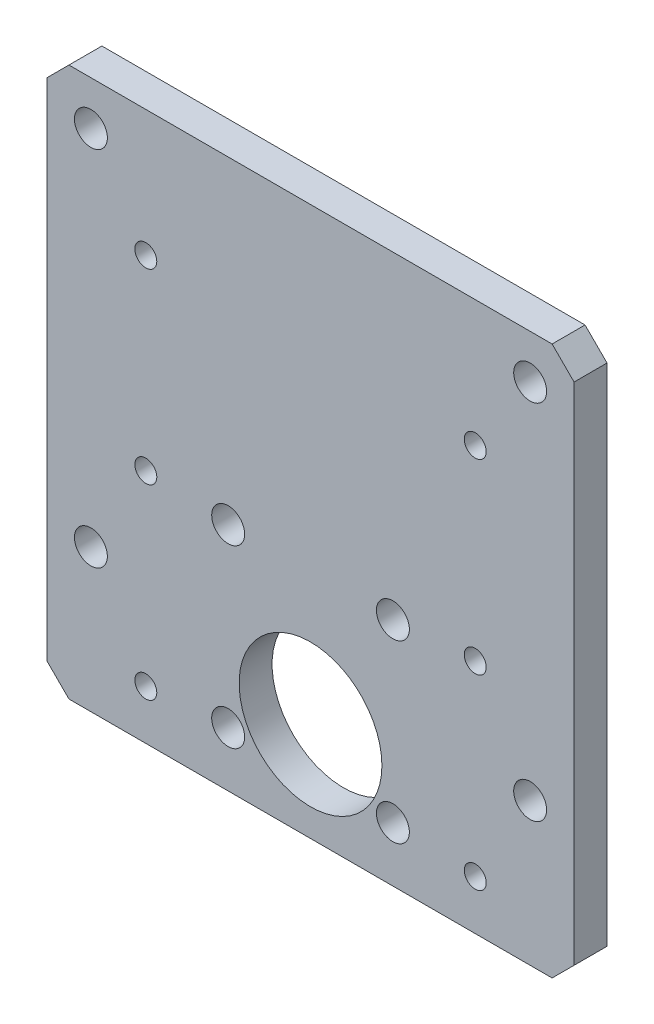
ISO-10303-21;
HEADER;
FILE_DESCRIPTION(('STEP AP214'),'2;1');
FILE_NAME('part.step','',(''),(''),'','','');
FILE_SCHEMA(('AUTOMOTIVE_DESIGN { 1 0 10303 214 1 1 1 1 }'));
ENDSEC;
DATA;
#1=APPLICATION_CONTEXT('core data for automotive mechanical design processes');
#2=APPLICATION_PROTOCOL_DEFINITION('international standard','automotive_design',2000,#1);
#3=PRODUCT_CONTEXT('',#1,'mechanical');
#4=PRODUCT('Part','Part','',(#3));
#5=PRODUCT_RELATED_PRODUCT_CATEGORY('part','',(#4));
#6=PRODUCT_DEFINITION_FORMATION('','',#4);
#7=PRODUCT_DEFINITION_CONTEXT('part definition',#1,'design');
#8=PRODUCT_DEFINITION('design','',#6,#7);
#9=PRODUCT_DEFINITION_SHAPE('','',#8);
#10=(LENGTH_UNIT() NAMED_UNIT(*) SI_UNIT(.MILLI.,.METRE.));
#11=(NAMED_UNIT(*) PLANE_ANGLE_UNIT() SI_UNIT($,.RADIAN.));
#12=(NAMED_UNIT(*) SI_UNIT($,.STERADIAN.) SOLID_ANGLE_UNIT());
#13=UNCERTAINTY_MEASURE_WITH_UNIT(LENGTH_MEASURE(1.E-05),#10,'distance_accuracy_value','');
#14=(GEOMETRIC_REPRESENTATION_CONTEXT(3) GLOBAL_UNCERTAINTY_ASSIGNED_CONTEXT((#13)) GLOBAL_UNIT_ASSIGNED_CONTEXT((#10,
#11,#12)) REPRESENTATION_CONTEXT('',''));
#15=CARTESIAN_POINT('',(0.,0.,0.));
#16=DIRECTION('',(0.,0.,1.));
#17=DIRECTION('',(1.,0.,0.));
#18=AXIS2_PLACEMENT_3D('',#15,#16,#17);
#19=CARTESIAN_POINT('',(0.,0.,3.));
#20=DIRECTION('',(0.,0.,1.));
#21=DIRECTION('',(1.,0.,0.));
#22=AXIS2_PLACEMENT_3D('',#19,#20,#21);
#23=PLANE('',#22);
#24=CARTESIAN_POINT('',(-20.,33.,3.));
#25=DIRECTION('',(0.,0.,1.));
#26=DIRECTION('',(1.,0.,0.));
#27=AXIS2_PLACEMENT_3D('',#24,#25,#26);
#28=CIRCLE('',#27,1.5);
#29=CARTESIAN_POINT('',(-18.5,33.,3.));
#30=VERTEX_POINT('',#29);
#31=EDGE_CURVE('E504',#30,#30,#28,.T.);
#32=ORIENTED_EDGE('',*,*,#31,.F.);
#33=EDGE_LOOP('',(#32));
#34=FACE_BOUND('',#33,.T.);
#35=CARTESIAN_POINT('',(20.,33.,3.));
#36=DIRECTION('',(0.,0.,1.));
#37=DIRECTION('',(-1.,0.,0.));
#38=AXIS2_PLACEMENT_3D('',#35,#36,#37);
#39=CIRCLE('',#38,1.5);
#40=CARTESIAN_POINT('',(18.5,33.,3.));
#41=VERTEX_POINT('',#40);
#42=EDGE_CURVE('E509',#41,#41,#39,.T.);
#43=ORIENTED_EDGE('',*,*,#42,.F.);
#44=EDGE_LOOP('',(#43));
#45=FACE_BOUND('',#44,.T.);
#46=CARTESIAN_POINT('',(15.,25.5,3.));
#47=DIRECTION('',(0.,0.,1.));
#48=DIRECTION('',(-1.,0.,0.));
#49=AXIS2_PLACEMENT_3D('',#46,#47,#48);
#50=CIRCLE('',#49,1.);
#51=CARTESIAN_POINT('',(14.,25.5,3.));
#52=VERTEX_POINT('',#51);
#53=EDGE_CURVE('E515',#52,#52,#50,.T.);
#54=ORIENTED_EDGE('',*,*,#53,.F.);
#55=EDGE_LOOP('',(#54));
#56=FACE_BOUND('',#55,.T.);
#57=CARTESIAN_POINT('',(-15.,25.5,3.));
#58=DIRECTION('',(0.,0.,1.));
#59=DIRECTION('',(1.,0.,0.));
#60=AXIS2_PLACEMENT_3D('',#57,#58,#59);
#61=CIRCLE('',#60,1.);
#62=CARTESIAN_POINT('',(-14.,25.5,3.));
#63=VERTEX_POINT('',#62);
#64=EDGE_CURVE('E172',#63,#63,#61,.T.);
#65=ORIENTED_EDGE('',*,*,#64,.F.);
#66=EDGE_LOOP('',(#65));
#67=FACE_BOUND('',#66,.T.);
#68=CARTESIAN_POINT('',(-20.,0.,3.));
#69=DIRECTION('',(0.,0.,1.));
#70=DIRECTION('',(-1.,0.,0.));
#71=AXIS2_PLACEMENT_3D('',#68,#69,#70);
#72=CIRCLE('',#71,1.5);
#73=CARTESIAN_POINT('',(-21.5,0.,3.));
#74=VERTEX_POINT('',#73);
#75=EDGE_CURVE('E182',#74,#74,#72,.T.);
#76=ORIENTED_EDGE('',*,*,#75,.F.);
#77=EDGE_LOOP('',(#76));
#78=FACE_BOUND('',#77,.T.);
#79=CARTESIAN_POINT('',(-15.,-8.5,3.));
#80=DIRECTION('',(0.,0.,1.));
#81=DIRECTION('',(1.,0.,0.));
#82=AXIS2_PLACEMENT_3D('',#79,#80,#81);
#83=CIRCLE('',#82,1.);
#84=CARTESIAN_POINT('',(-14.,-8.5,3.));
#85=VERTEX_POINT('',#84);
#86=EDGE_CURVE('E194',#85,#85,#83,.T.);
#87=ORIENTED_EDGE('',*,*,#86,.F.);
#88=EDGE_LOOP('',(#87));
#89=FACE_BOUND('',#88,.T.);
#90=CARTESIAN_POINT('',(-15.,8.50000000000001,3.));
#91=DIRECTION('',(0.,0.,1.));
#92=DIRECTION('',(-1.,0.,0.));
#93=AXIS2_PLACEMENT_3D('',#90,#91,#92);
#94=CIRCLE('',#93,1.);
#95=CARTESIAN_POINT('',(-16.,8.50000000000001,3.));
#96=VERTEX_POINT('',#95);
#97=EDGE_CURVE('E206',#96,#96,#94,.T.);
#98=ORIENTED_EDGE('',*,*,#97,.F.);
#99=EDGE_LOOP('',(#98));
#100=FACE_BOUND('',#99,.T.);
#101=CARTESIAN_POINT('',(15.,-8.49999999999999,3.));
#102=DIRECTION('',(0.,0.,1.));
#103=DIRECTION('',(-1.,0.,0.));
#104=AXIS2_PLACEMENT_3D('',#101,#102,#103);
#105=CIRCLE('',#104,1.00000000000001);
#106=CARTESIAN_POINT('',(14.,-8.49999999999999,3.));
#107=VERTEX_POINT('',#106);
#108=EDGE_CURVE('E218',#107,#107,#105,.T.);
#109=ORIENTED_EDGE('',*,*,#108,.F.);
#110=EDGE_LOOP('',(#109));
#111=FACE_BOUND('',#110,.T.);
#112=CARTESIAN_POINT('',(15.,8.5,3.));
#113=DIRECTION('',(0.,0.,1.));
#114=DIRECTION('',(1.,0.,0.));
#115=AXIS2_PLACEMENT_3D('',#112,#113,#114);
#116=CIRCLE('',#115,1.00000000000001);
#117=CARTESIAN_POINT('',(16.,8.5,3.));
#118=VERTEX_POINT('',#117);
#119=EDGE_CURVE('E230',#118,#118,#116,.T.);
#120=ORIENTED_EDGE('',*,*,#119,.F.);
#121=EDGE_LOOP('',(#120));
#122=FACE_BOUND('',#121,.T.);
#123=DIRECTION('',(0.,-1.,0.));
#124=VECTOR('',#123,1.);
#125=CARTESIAN_POINT('',(-24.,13.,3.));
#126=LINE('',#125,#124);
#127=CARTESIAN_POINT('',(-24.,35.,3.));
#128=VERTEX_POINT('',#127);
#129=CARTESIAN_POINT('',(-24.,-11.,3.));
#130=VERTEX_POINT('',#129);
#131=EDGE_CURVE('E133',#128,#130,#126,.T.);
#132=ORIENTED_EDGE('',*,*,#131,.T.);
#133=DIRECTION('',(-0.707106781186547,0.707106781186548,0.));
#134=VECTOR('',#133,1.);
#135=CARTESIAN_POINT('',(-17.5,-17.5,3.));
#136=LINE('',#135,#134);
#137=CARTESIAN_POINT('',(-22.,-13.,3.));
#138=VERTEX_POINT('',#137);
#139=EDGE_CURVE('E150',#130,#138,#136,.F.);
#140=ORIENTED_EDGE('',*,*,#139,.T.);
#141=DIRECTION('',(1.,0.,0.));
#142=VECTOR('',#141,1.);
#143=CARTESIAN_POINT('',(-24.,-13.,3.));
#144=LINE('',#143,#142);
#145=CARTESIAN_POINT('',(22.,-13.,3.));
#146=VERTEX_POINT('',#145);
#147=EDGE_CURVE('E123',#138,#146,#144,.T.);
#148=ORIENTED_EDGE('',*,*,#147,.T.);
#149=DIRECTION('',(-0.707106781186549,-0.707106781186546,0.));
#150=VECTOR('',#149,1.);
#151=CARTESIAN_POINT('',(17.4999999999999,-17.5,3.));
#152=LINE('',#151,#150);
#153=CARTESIAN_POINT('',(24.,-11.,3.));
#154=VERTEX_POINT('',#153);
#155=EDGE_CURVE('E148',#146,#154,#152,.F.);
#156=ORIENTED_EDGE('',*,*,#155,.T.);
#157=DIRECTION('',(0.,1.,0.));
#158=VECTOR('',#157,1.);
#159=CARTESIAN_POINT('',(24.,13.,3.));
#160=LINE('',#159,#158);
#161=CARTESIAN_POINT('',(24.,35.,3.));
#162=VERTEX_POINT('',#161);
#163=EDGE_CURVE('E130',#154,#162,#160,.T.);
#164=ORIENTED_EDGE('',*,*,#163,.T.);
#165=DIRECTION('',(-0.707106781186546,0.707106781186549,0.));
#166=VECTOR('',#165,1.);
#167=CARTESIAN_POINT('',(29.5,29.4999999999999,3.));
#168=LINE('',#167,#166);
#169=CARTESIAN_POINT('',(22.,37.,3.));
#170=VERTEX_POINT('',#169);
#171=EDGE_CURVE('E50',#162,#170,#168,.T.);
#172=ORIENTED_EDGE('',*,*,#171,.T.);
#173=DIRECTION('',(1.,0.,0.));
#174=VECTOR('',#173,1.);
#175=CARTESIAN_POINT('',(-24.,37.,3.));
#176=LINE('',#175,#174);
#177=CARTESIAN_POINT('',(-22.,37.,3.));
#178=VERTEX_POINT('',#177);
#179=EDGE_CURVE('E159',#178,#170,#176,.T.);
#180=ORIENTED_EDGE('',*,*,#179,.F.);
#181=DIRECTION('',(-0.707106781186546,-0.707106781186549,0.));
#182=VECTOR('',#181,1.);
#183=CARTESIAN_POINT('',(-29.5,29.4999999999999,3.));
#184=LINE('',#183,#182);
#185=EDGE_CURVE('E58',#178,#128,#184,.T.);
#186=ORIENTED_EDGE('',*,*,#185,.T.);
#187=EDGE_LOOP('',(#132,#140,#148,#156,#164,#172,#180,#186));
#188=FACE_BOUND('',#187,.T.);
#189=CARTESIAN_POINT('',(20.,0.,3.));
#190=DIRECTION('',(0.,0.,1.));
#191=DIRECTION('',(1.,0.,0.));
#192=AXIS2_PLACEMENT_3D('',#189,#190,#191);
#193=CIRCLE('',#192,1.5);
#194=CARTESIAN_POINT('',(21.5,0.,3.));
#195=VERTEX_POINT('',#194);
#196=EDGE_CURVE('E236',#195,#195,#193,.T.);
#197=ORIENTED_EDGE('',*,*,#196,.F.);
#198=EDGE_LOOP('',(#197));
#199=FACE_BOUND('',#198,.T.);
#200=CARTESIAN_POINT('',(7.5,8.,3.));
#201=DIRECTION('',(0.,0.,1.));
#202=DIRECTION('',(1.,0.,0.));
#203=AXIS2_PLACEMENT_3D('',#200,#201,#202);
#204=CIRCLE('',#203,1.5);
#205=CARTESIAN_POINT('',(9.,8.,3.));
#206=VERTEX_POINT('',#205);
#207=EDGE_CURVE('E224',#206,#206,#204,.T.);
#208=ORIENTED_EDGE('',*,*,#207,.F.);
#209=EDGE_LOOP('',(#208));
#210=FACE_BOUND('',#209,.T.);
#211=CARTESIAN_POINT('',(7.5,-8.,3.));
#212=DIRECTION('',(0.,0.,1.));
#213=DIRECTION('',(-1.,0.,0.));
#214=AXIS2_PLACEMENT_3D('',#211,#212,#213);
#215=CIRCLE('',#214,1.5);
#216=CARTESIAN_POINT('',(6.,-8.,3.));
#217=VERTEX_POINT('',#216);
#218=EDGE_CURVE('E212',#217,#217,#215,.T.);
#219=ORIENTED_EDGE('',*,*,#218,.F.);
#220=EDGE_LOOP('',(#219));
#221=FACE_BOUND('',#220,.T.);
#222=CARTESIAN_POINT('',(-7.49999999999999,-8.,3.));
#223=DIRECTION('',(0.,0.,1.));
#224=DIRECTION('',(1.,0.,0.));
#225=AXIS2_PLACEMENT_3D('',#222,#223,#224);
#226=CIRCLE('',#225,1.5);
#227=CARTESIAN_POINT('',(-5.99999999999999,-8.,3.));
#228=VERTEX_POINT('',#227);
#229=EDGE_CURVE('E200',#228,#228,#226,.T.);
#230=ORIENTED_EDGE('',*,*,#229,.F.);
#231=EDGE_LOOP('',(#230));
#232=FACE_BOUND('',#231,.T.);
#233=CARTESIAN_POINT('',(-7.49999999999999,8.00000000000001,3.));
#234=DIRECTION('',(0.,0.,1.));
#235=DIRECTION('',(-1.,0.,0.));
#236=AXIS2_PLACEMENT_3D('',#233,#234,#235);
#237=CIRCLE('',#236,1.5);
#238=CARTESIAN_POINT('',(-8.99999999999999,8.00000000000001,3.));
#239=VERTEX_POINT('',#238);
#240=EDGE_CURVE('E188',#239,#239,#237,.T.);
#241=ORIENTED_EDGE('',*,*,#240,.F.);
#242=EDGE_LOOP('',(#241));
#243=FACE_BOUND('',#242,.T.);
#244=CARTESIAN_POINT('',(0.,-4.,3.));
#245=DIRECTION('',(0.,0.,1.));
#246=DIRECTION('',(1.,0.,0.));
#247=AXIS2_PLACEMENT_3D('',#244,#245,#246);
#248=CIRCLE('',#247,6.5);
#249=CARTESIAN_POINT('',(6.5,-4.,3.));
#250=VERTEX_POINT('',#249);
#251=EDGE_CURVE('E176',#250,#250,#248,.T.);
#252=ORIENTED_EDGE('',*,*,#251,.F.);
#253=EDGE_LOOP('',(#252));
#254=FACE_BOUND('',#253,.T.);
#255=ADVANCED_FACE('F35',(#34,#45,#56,#67,#78,#89,#100,#111,#122,#188,#199,#210,#221,#232,#243,
#254),#23,.T.);
#256=CARTESIAN_POINT('',(0.,0.,0.));
#257=DIRECTION('',(0.,0.,1.));
#258=DIRECTION('',(1.,0.,0.));
#259=AXIS2_PLACEMENT_3D('',#256,#257,#258);
#260=PLANE('',#259);
#261=CARTESIAN_POINT('',(-20.,33.,0.));
#262=DIRECTION('',(0.,0.,1.));
#263=DIRECTION('',(1.,0.,0.));
#264=AXIS2_PLACEMENT_3D('',#261,#262,#263);
#265=CIRCLE('',#264,1.5);
#266=CARTESIAN_POINT('',(-18.5,33.,0.));
#267=VERTEX_POINT('',#266);
#268=EDGE_CURVE('E502',#267,#267,#265,.F.);
#269=ORIENTED_EDGE('',*,*,#268,.F.);
#270=EDGE_LOOP('',(#269));
#271=FACE_BOUND('',#270,.T.);
#272=CARTESIAN_POINT('',(20.,33.,0.));
#273=DIRECTION('',(0.,0.,1.));
#274=DIRECTION('',(1.,0.,0.));
#275=AXIS2_PLACEMENT_3D('',#272,#273,#274);
#276=CIRCLE('',#275,1.5);
#277=CARTESIAN_POINT('',(21.5,33.,0.));
#278=VERTEX_POINT('',#277);
#279=EDGE_CURVE('E505',#278,#278,#276,.F.);
#280=ORIENTED_EDGE('',*,*,#279,.F.);
#281=EDGE_LOOP('',(#280));
#282=FACE_BOUND('',#281,.T.);
#283=CARTESIAN_POINT('',(15.,25.5,0.));
#284=DIRECTION('',(0.,0.,1.));
#285=DIRECTION('',(1.,0.,0.));
#286=AXIS2_PLACEMENT_3D('',#283,#284,#285);
#287=CIRCLE('',#286,1.);
#288=CARTESIAN_POINT('',(16.,25.5,0.));
#289=VERTEX_POINT('',#288);
#290=EDGE_CURVE('E513',#289,#289,#287,.F.);
#291=ORIENTED_EDGE('',*,*,#290,.F.);
#292=EDGE_LOOP('',(#291));
#293=FACE_BOUND('',#292,.T.);
#294=CARTESIAN_POINT('',(-15.,25.5,0.));
#295=DIRECTION('',(0.,0.,1.));
#296=DIRECTION('',(1.,0.,0.));
#297=AXIS2_PLACEMENT_3D('',#294,#295,#296);
#298=CIRCLE('',#297,1.);
#299=CARTESIAN_POINT('',(-14.,25.5,0.));
#300=VERTEX_POINT('',#299);
#301=EDGE_CURVE('E167',#300,#300,#298,.F.);
#302=ORIENTED_EDGE('',*,*,#301,.F.);
#303=EDGE_LOOP('',(#302));
#304=FACE_BOUND('',#303,.T.);
#305=DIRECTION('',(1.,0.,0.));
#306=VECTOR('',#305,1.);
#307=CARTESIAN_POINT('',(-24.,-13.,0.));
#308=LINE('',#307,#306);
#309=CARTESIAN_POINT('',(-22.,-13.,0.));
#310=VERTEX_POINT('',#309);
#311=CARTESIAN_POINT('',(22.,-13.,0.));
#312=VERTEX_POINT('',#311);
#313=EDGE_CURVE('E120',#310,#312,#308,.T.);
#314=ORIENTED_EDGE('',*,*,#313,.F.);
#315=DIRECTION('',(0.707106781186547,-0.707106781186548,0.));
#316=VECTOR('',#315,1.);
#317=CARTESIAN_POINT('',(-22.,-13.,0.));
#318=LINE('',#317,#316);
#319=CARTESIAN_POINT('',(-24.,-11.,0.));
#320=VERTEX_POINT('',#319);
#321=EDGE_CURVE('E103',#310,#320,#318,.F.);
#322=ORIENTED_EDGE('',*,*,#321,.T.);
#323=DIRECTION('',(0.,-1.,0.));
#324=VECTOR('',#323,1.);
#325=CARTESIAN_POINT('',(-24.,13.,0.));
#326=LINE('',#325,#324);
#327=CARTESIAN_POINT('',(-24.,35.,0.));
#328=VERTEX_POINT('',#327);
#329=EDGE_CURVE('E131',#328,#320,#326,.T.);
#330=ORIENTED_EDGE('',*,*,#329,.F.);
#331=DIRECTION('',(0.707106781186546,0.707106781186549,0.));
#332=VECTOR('',#331,1.);
#333=CARTESIAN_POINT('',(-22.,37.,0.));
#334=LINE('',#333,#332);
#335=CARTESIAN_POINT('',(-22.,37.,0.));
#336=VERTEX_POINT('',#335);
#337=EDGE_CURVE('E124',#328,#336,#334,.T.);
#338=ORIENTED_EDGE('',*,*,#337,.T.);
#339=DIRECTION('',(-1.,0.,0.));
#340=VECTOR('',#339,1.);
#341=CARTESIAN_POINT('',(-24.,37.,0.));
#342=LINE('',#341,#340);
#343=CARTESIAN_POINT('',(22.,37.,0.));
#344=VERTEX_POINT('',#343);
#345=EDGE_CURVE('E162',#344,#336,#342,.T.);
#346=ORIENTED_EDGE('',*,*,#345,.F.);
#347=DIRECTION('',(0.707106781186546,-0.707106781186549,0.));
#348=VECTOR('',#347,1.);
#349=CARTESIAN_POINT('',(22.,37.,0.));
#350=LINE('',#349,#348);
#351=CARTESIAN_POINT('',(24.,35.,0.));
#352=VERTEX_POINT('',#351);
#353=EDGE_CURVE('E141',#344,#352,#350,.T.);
#354=ORIENTED_EDGE('',*,*,#353,.T.);
#355=DIRECTION('',(0.,1.,0.));
#356=VECTOR('',#355,1.);
#357=CARTESIAN_POINT('',(24.,13.,0.));
#358=LINE('',#357,#356);
#359=CARTESIAN_POINT('',(24.,-11.,0.));
#360=VERTEX_POINT('',#359);
#361=EDGE_CURVE('E135',#360,#352,#358,.T.);
#362=ORIENTED_EDGE('',*,*,#361,.F.);
#363=DIRECTION('',(0.707106781186549,0.707106781186546,0.));
#364=VECTOR('',#363,1.);
#365=CARTESIAN_POINT('',(24.,-11.,0.));
#366=LINE('',#365,#364);
#367=EDGE_CURVE('E114',#360,#312,#366,.F.);
#368=ORIENTED_EDGE('',*,*,#367,.T.);
#369=EDGE_LOOP('',(#314,#322,#330,#338,#346,#354,#362,#368));
#370=FACE_BOUND('',#369,.T.);
#371=CARTESIAN_POINT('',(20.,0.,0.));
#372=DIRECTION('',(0.,0.,1.));
#373=DIRECTION('',(1.,0.,0.));
#374=AXIS2_PLACEMENT_3D('',#371,#372,#373);
#375=CIRCLE('',#374,1.5);
#376=CARTESIAN_POINT('',(21.5,0.,0.));
#377=VERTEX_POINT('',#376);
#378=EDGE_CURVE('E233',#377,#377,#375,.T.);
#379=ORIENTED_EDGE('',*,*,#378,.T.);
#380=EDGE_LOOP('',(#379));
#381=FACE_BOUND('',#380,.T.);
#382=CARTESIAN_POINT('',(15.,8.5,0.));
#383=DIRECTION('',(0.,0.,1.));
#384=DIRECTION('',(1.,0.,0.));
#385=AXIS2_PLACEMENT_3D('',#382,#383,#384);
#386=CIRCLE('',#385,1.00000000000001);
#387=CARTESIAN_POINT('',(16.,8.5,0.));
#388=VERTEX_POINT('',#387);
#389=EDGE_CURVE('E227',#388,#388,#386,.T.);
#390=ORIENTED_EDGE('',*,*,#389,.T.);
#391=EDGE_LOOP('',(#390));
#392=FACE_BOUND('',#391,.T.);
#393=CARTESIAN_POINT('',(7.5,8.,0.));
#394=DIRECTION('',(0.,0.,1.));
#395=DIRECTION('',(1.,0.,0.));
#396=AXIS2_PLACEMENT_3D('',#393,#394,#395);
#397=CIRCLE('',#396,1.5);
#398=CARTESIAN_POINT('',(9.,8.,0.));
#399=VERTEX_POINT('',#398);
#400=EDGE_CURVE('E221',#399,#399,#397,.T.);
#401=ORIENTED_EDGE('',*,*,#400,.T.);
#402=EDGE_LOOP('',(#401));
#403=FACE_BOUND('',#402,.T.);
#404=CARTESIAN_POINT('',(15.,-8.49999999999999,0.));
#405=DIRECTION('',(0.,0.,1.));
#406=DIRECTION('',(-1.,0.,0.));
#407=AXIS2_PLACEMENT_3D('',#404,#405,#406);
#408=CIRCLE('',#407,1.00000000000001);
#409=CARTESIAN_POINT('',(14.,-8.49999999999999,0.));
#410=VERTEX_POINT('',#409);
#411=EDGE_CURVE('E215',#410,#410,#408,.T.);
#412=ORIENTED_EDGE('',*,*,#411,.T.);
#413=EDGE_LOOP('',(#412));
#414=FACE_BOUND('',#413,.T.);
#415=CARTESIAN_POINT('',(7.5,-8.,0.));
#416=DIRECTION('',(0.,0.,1.));
#417=DIRECTION('',(-1.,0.,0.));
#418=AXIS2_PLACEMENT_3D('',#415,#416,#417);
#419=CIRCLE('',#418,1.5);
#420=CARTESIAN_POINT('',(6.,-8.,0.));
#421=VERTEX_POINT('',#420);
#422=EDGE_CURVE('E209',#421,#421,#419,.T.);
#423=ORIENTED_EDGE('',*,*,#422,.T.);
#424=EDGE_LOOP('',(#423));
#425=FACE_BOUND('',#424,.T.);
#426=CARTESIAN_POINT('',(-15.,8.50000000000001,0.));
#427=DIRECTION('',(0.,0.,1.));
#428=DIRECTION('',(-1.,0.,0.));
#429=AXIS2_PLACEMENT_3D('',#426,#427,#428);
#430=CIRCLE('',#429,1.);
#431=CARTESIAN_POINT('',(-16.,8.50000000000001,0.));
#432=VERTEX_POINT('',#431);
#433=EDGE_CURVE('E203',#432,#432,#430,.T.);
#434=ORIENTED_EDGE('',*,*,#433,.T.);
#435=EDGE_LOOP('',(#434));
#436=FACE_BOUND('',#435,.T.);
#437=CARTESIAN_POINT('',(-7.49999999999999,-8.,0.));
#438=DIRECTION('',(0.,0.,1.));
#439=DIRECTION('',(1.,0.,0.));
#440=AXIS2_PLACEMENT_3D('',#437,#438,#439);
#441=CIRCLE('',#440,1.5);
#442=CARTESIAN_POINT('',(-5.99999999999999,-8.,0.));
#443=VERTEX_POINT('',#442);
#444=EDGE_CURVE('E197',#443,#443,#441,.T.);
#445=ORIENTED_EDGE('',*,*,#444,.T.);
#446=EDGE_LOOP('',(#445));
#447=FACE_BOUND('',#446,.T.);
#448=CARTESIAN_POINT('',(-15.,-8.5,0.));
#449=DIRECTION('',(0.,0.,1.));
#450=DIRECTION('',(1.,0.,0.));
#451=AXIS2_PLACEMENT_3D('',#448,#449,#450);
#452=CIRCLE('',#451,1.);
#453=CARTESIAN_POINT('',(-14.,-8.5,0.));
#454=VERTEX_POINT('',#453);
#455=EDGE_CURVE('E191',#454,#454,#452,.T.);
#456=ORIENTED_EDGE('',*,*,#455,.T.);
#457=EDGE_LOOP('',(#456));
#458=FACE_BOUND('',#457,.T.);
#459=CARTESIAN_POINT('',(-7.49999999999999,8.00000000000001,0.));
#460=DIRECTION('',(0.,0.,1.));
#461=DIRECTION('',(-1.,0.,0.));
#462=AXIS2_PLACEMENT_3D('',#459,#460,#461);
#463=CIRCLE('',#462,1.5);
#464=CARTESIAN_POINT('',(-8.99999999999999,8.00000000000001,0.));
#465=VERTEX_POINT('',#464);
#466=EDGE_CURVE('E185',#465,#465,#463,.T.);
#467=ORIENTED_EDGE('',*,*,#466,.T.);
#468=EDGE_LOOP('',(#467));
#469=FACE_BOUND('',#468,.T.);
#470=CARTESIAN_POINT('',(-20.,0.,0.));
#471=DIRECTION('',(0.,0.,1.));
#472=DIRECTION('',(-1.,0.,0.));
#473=AXIS2_PLACEMENT_3D('',#470,#471,#472);
#474=CIRCLE('',#473,1.5);
#475=CARTESIAN_POINT('',(-21.5,0.,0.));
#476=VERTEX_POINT('',#475);
#477=EDGE_CURVE('E179',#476,#476,#474,.T.);
#478=ORIENTED_EDGE('',*,*,#477,.T.);
#479=EDGE_LOOP('',(#478));
#480=FACE_BOUND('',#479,.T.);
#481=CARTESIAN_POINT('',(0.,-4.,0.));
#482=DIRECTION('',(0.,0.,1.));
#483=DIRECTION('',(1.,0.,0.));
#484=AXIS2_PLACEMENT_3D('',#481,#482,#483);
#485=CIRCLE('',#484,6.5);
#486=CARTESIAN_POINT('',(6.5,-4.,0.));
#487=VERTEX_POINT('',#486);
#488=EDGE_CURVE('E169',#487,#487,#485,.T.);
#489=ORIENTED_EDGE('',*,*,#488,.T.);
#490=EDGE_LOOP('',(#489));
#491=FACE_BOUND('',#490,.T.);
#492=ADVANCED_FACE('F127',(#271,#282,#293,#304,#370,#381,#392,#403,#414,#425,#436,#447,#458,
#469,#480,#491),#260,.F.);
#493=CARTESIAN_POINT('',(24.,13.,3.));
#494=DIRECTION('',(-1.,0.,0.));
#495=DIRECTION('',(0.,-1.,0.));
#496=AXIS2_PLACEMENT_3D('',#493,#494,#495);
#497=PLANE('',#496);
#498=ORIENTED_EDGE('',*,*,#163,.F.);
#499=DIRECTION('',(0.,0.,-1.));
#500=VECTOR('',#499,1.);
#501=CARTESIAN_POINT('',(24.,-11.,3.));
#502=LINE('',#501,#500);
#503=EDGE_CURVE('E154',#154,#360,#502,.T.);
#504=ORIENTED_EDGE('',*,*,#503,.T.);
#505=ORIENTED_EDGE('',*,*,#361,.T.);
#506=DIRECTION('',(0.,0.,1.));
#507=VECTOR('',#506,1.);
#508=CARTESIAN_POINT('',(24.,35.,3.));
#509=LINE('',#508,#507);
#510=EDGE_CURVE('E152',#352,#162,#509,.T.);
#511=ORIENTED_EDGE('',*,*,#510,.T.);
#512=EDGE_LOOP('',(#498,#504,#505,#511));
#513=FACE_BOUND('',#512,.T.);
#514=ADVANCED_FACE('F246',(#513),#497,.F.);
#515=CARTESIAN_POINT('',(-24.,13.,3.));
#516=DIRECTION('',(1.,0.,0.));
#517=DIRECTION('',(0.,1.,0.));
#518=AXIS2_PLACEMENT_3D('',#515,#516,#517);
#519=PLANE('',#518);
#520=ORIENTED_EDGE('',*,*,#329,.T.);
#521=DIRECTION('',(0.,0.,1.));
#522=VECTOR('',#521,1.);
#523=CARTESIAN_POINT('',(-24.,-11.,3.));
#524=LINE('',#523,#522);
#525=EDGE_CURVE('E108',#320,#130,#524,.T.);
#526=ORIENTED_EDGE('',*,*,#525,.T.);
#527=ORIENTED_EDGE('',*,*,#131,.F.);
#528=DIRECTION('',(0.,0.,-1.));
#529=VECTOR('',#528,1.);
#530=CARTESIAN_POINT('',(-24.,35.,0.));
#531=LINE('',#530,#529);
#532=EDGE_CURVE('E113',#128,#328,#531,.T.);
#533=ORIENTED_EDGE('',*,*,#532,.T.);
#534=EDGE_LOOP('',(#520,#526,#527,#533));
#535=FACE_BOUND('',#534,.T.);
#536=ADVANCED_FACE('F251',(#535),#519,.F.);
#537=CARTESIAN_POINT('',(-24.,-13.,3.));
#538=DIRECTION('',(0.,1.,0.));
#539=DIRECTION('',(-1.,0.,0.));
#540=AXIS2_PLACEMENT_3D('',#537,#538,#539);
#541=PLANE('',#540);
#542=ORIENTED_EDGE('',*,*,#147,.F.);
#543=DIRECTION('',(0.,0.,-1.));
#544=VECTOR('',#543,1.);
#545=CARTESIAN_POINT('',(-22.,-13.,3.));
#546=LINE('',#545,#544);
#547=EDGE_CURVE('E107',#138,#310,#546,.T.);
#548=ORIENTED_EDGE('',*,*,#547,.T.);
#549=ORIENTED_EDGE('',*,*,#313,.T.);
#550=DIRECTION('',(0.,0.,1.));
#551=VECTOR('',#550,1.);
#552=CARTESIAN_POINT('',(22.,-13.,3.));
#553=LINE('',#552,#551);
#554=EDGE_CURVE('E125',#312,#146,#553,.T.);
#555=ORIENTED_EDGE('',*,*,#554,.T.);
#556=EDGE_LOOP('',(#542,#548,#549,#555));
#557=FACE_BOUND('',#556,.T.);
#558=ADVANCED_FACE('F119',(#557),#541,.F.);
#559=CARTESIAN_POINT('',(20.,0.,3.));
#560=DIRECTION('',(0.,0.,-1.));
#561=DIRECTION('',(-1.,0.,0.));
#562=AXIS2_PLACEMENT_3D('',#559,#560,#561);
#563=CYLINDRICAL_SURFACE('',#562,1.5);
#564=ORIENTED_EDGE('',*,*,#196,.T.);
#565=EDGE_LOOP('',(#564));
#566=FACE_BOUND('',#565,.T.);
#567=ORIENTED_EDGE('',*,*,#378,.F.);
#568=EDGE_LOOP('',(#567));
#569=FACE_BOUND('',#568,.T.);
#570=ADVANCED_FACE('F274',(#566,#569),#563,.F.);
#571=CARTESIAN_POINT('',(15.,8.5,3.));
#572=DIRECTION('',(0.,0.,-1.));
#573=DIRECTION('',(-1.,0.,0.));
#574=AXIS2_PLACEMENT_3D('',#571,#572,#573);
#575=CYLINDRICAL_SURFACE('',#574,1.00000000000001);
#576=ORIENTED_EDGE('',*,*,#119,.T.);
#577=EDGE_LOOP('',(#576));
#578=FACE_BOUND('',#577,.T.);
#579=ORIENTED_EDGE('',*,*,#389,.F.);
#580=EDGE_LOOP('',(#579));
#581=FACE_BOUND('',#580,.T.);
#582=ADVANCED_FACE('F301',(#578,#581),#575,.F.);
#583=CARTESIAN_POINT('',(7.5,8.,3.));
#584=DIRECTION('',(0.,0.,-1.));
#585=DIRECTION('',(-1.,0.,0.));
#586=AXIS2_PLACEMENT_3D('',#583,#584,#585);
#587=CYLINDRICAL_SURFACE('',#586,1.5);
#588=ORIENTED_EDGE('',*,*,#207,.T.);
#589=EDGE_LOOP('',(#588));
#590=FACE_BOUND('',#589,.T.);
#591=ORIENTED_EDGE('',*,*,#400,.F.);
#592=EDGE_LOOP('',(#591));
#593=FACE_BOUND('',#592,.T.);
#594=ADVANCED_FACE('F308',(#590,#593),#587,.F.);
#595=CARTESIAN_POINT('',(15.,-8.49999999999999,3.));
#596=DIRECTION('',(0.,0.,-1.));
#597=DIRECTION('',(-1.,0.,0.));
#598=AXIS2_PLACEMENT_3D('',#595,#596,#597);
#599=CYLINDRICAL_SURFACE('',#598,1.00000000000001);
#600=ORIENTED_EDGE('',*,*,#108,.T.);
#601=EDGE_LOOP('',(#600));
#602=FACE_BOUND('',#601,.T.);
#603=ORIENTED_EDGE('',*,*,#411,.F.);
#604=EDGE_LOOP('',(#603));
#605=FACE_BOUND('',#604,.T.);
#606=ADVANCED_FACE('F315',(#602,#605),#599,.F.);
#607=CARTESIAN_POINT('',(7.5,-8.,3.));
#608=DIRECTION('',(0.,0.,-1.));
#609=DIRECTION('',(-1.,0.,0.));
#610=AXIS2_PLACEMENT_3D('',#607,#608,#609);
#611=CYLINDRICAL_SURFACE('',#610,1.5);
#612=ORIENTED_EDGE('',*,*,#218,.T.);
#613=EDGE_LOOP('',(#612));
#614=FACE_BOUND('',#613,.T.);
#615=ORIENTED_EDGE('',*,*,#422,.F.);
#616=EDGE_LOOP('',(#615));
#617=FACE_BOUND('',#616,.T.);
#618=ADVANCED_FACE('F323',(#614,#617),#611,.F.);
#619=CARTESIAN_POINT('',(-15.,8.50000000000001,3.));
#620=DIRECTION('',(0.,0.,-1.));
#621=DIRECTION('',(-1.,0.,0.));
#622=AXIS2_PLACEMENT_3D('',#619,#620,#621);
#623=CYLINDRICAL_SURFACE('',#622,1.);
#624=ORIENTED_EDGE('',*,*,#97,.T.);
#625=EDGE_LOOP('',(#624));
#626=FACE_BOUND('',#625,.T.);
#627=ORIENTED_EDGE('',*,*,#433,.F.);
#628=EDGE_LOOP('',(#627));
#629=FACE_BOUND('',#628,.T.);
#630=ADVANCED_FACE('F331',(#626,#629),#623,.F.);
#631=CARTESIAN_POINT('',(-7.49999999999999,-8.,3.));
#632=DIRECTION('',(0.,0.,-1.));
#633=DIRECTION('',(-1.,0.,0.));
#634=AXIS2_PLACEMENT_3D('',#631,#632,#633);
#635=CYLINDRICAL_SURFACE('',#634,1.5);
#636=ORIENTED_EDGE('',*,*,#229,.T.);
#637=EDGE_LOOP('',(#636));
#638=FACE_BOUND('',#637,.T.);
#639=ORIENTED_EDGE('',*,*,#444,.F.);
#640=EDGE_LOOP('',(#639));
#641=FACE_BOUND('',#640,.T.);
#642=ADVANCED_FACE('F339',(#638,#641),#635,.F.);
#643=CARTESIAN_POINT('',(-15.,-8.5,3.));
#644=DIRECTION('',(0.,0.,-1.));
#645=DIRECTION('',(-1.,0.,0.));
#646=AXIS2_PLACEMENT_3D('',#643,#644,#645);
#647=CYLINDRICAL_SURFACE('',#646,1.);
#648=ORIENTED_EDGE('',*,*,#86,.T.);
#649=EDGE_LOOP('',(#648));
#650=FACE_BOUND('',#649,.T.);
#651=ORIENTED_EDGE('',*,*,#455,.F.);
#652=EDGE_LOOP('',(#651));
#653=FACE_BOUND('',#652,.T.);
#654=ADVANCED_FACE('F347',(#650,#653),#647,.F.);
#655=CARTESIAN_POINT('',(-7.49999999999999,8.00000000000001,3.));
#656=DIRECTION('',(0.,0.,-1.));
#657=DIRECTION('',(-1.,0.,0.));
#658=AXIS2_PLACEMENT_3D('',#655,#656,#657);
#659=CYLINDRICAL_SURFACE('',#658,1.5);
#660=ORIENTED_EDGE('',*,*,#240,.T.);
#661=EDGE_LOOP('',(#660));
#662=FACE_BOUND('',#661,.T.);
#663=ORIENTED_EDGE('',*,*,#466,.F.);
#664=EDGE_LOOP('',(#663));
#665=FACE_BOUND('',#664,.T.);
#666=ADVANCED_FACE('F355',(#662,#665),#659,.F.);
#667=CARTESIAN_POINT('',(-20.,0.,3.));
#668=DIRECTION('',(0.,0.,-1.));
#669=DIRECTION('',(-1.,0.,0.));
#670=AXIS2_PLACEMENT_3D('',#667,#668,#669);
#671=CYLINDRICAL_SURFACE('',#670,1.5);
#672=ORIENTED_EDGE('',*,*,#75,.T.);
#673=EDGE_LOOP('',(#672));
#674=FACE_BOUND('',#673,.T.);
#675=ORIENTED_EDGE('',*,*,#477,.F.);
#676=EDGE_LOOP('',(#675));
#677=FACE_BOUND('',#676,.T.);
#678=ADVANCED_FACE('F363',(#674,#677),#671,.F.);
#679=CARTESIAN_POINT('',(0.,-4.,3.));
#680=DIRECTION('',(0.,0.,-1.));
#681=DIRECTION('',(-1.,0.,0.));
#682=AXIS2_PLACEMENT_3D('',#679,#680,#681);
#683=CYLINDRICAL_SURFACE('',#682,6.5);
#684=ORIENTED_EDGE('',*,*,#251,.T.);
#685=EDGE_LOOP('',(#684));
#686=FACE_BOUND('',#685,.T.);
#687=ORIENTED_EDGE('',*,*,#488,.F.);
#688=EDGE_LOOP('',(#687));
#689=FACE_BOUND('',#688,.T.);
#690=ADVANCED_FACE('F371',(#686,#689),#683,.F.);
#691=CARTESIAN_POINT('',(0.,37.,0.));
#692=DIRECTION('',(0.,1.,0.));
#693=DIRECTION('',(-1.,0.,0.));
#694=AXIS2_PLACEMENT_3D('',#691,#692,#693);
#695=PLANE('',#694);
#696=ORIENTED_EDGE('',*,*,#179,.T.);
#697=DIRECTION('',(0.,0.,-1.));
#698=VECTOR('',#697,1.);
#699=CARTESIAN_POINT('',(22.,37.,0.));
#700=LINE('',#699,#698);
#701=EDGE_CURVE('E11',#170,#344,#700,.T.);
#702=ORIENTED_EDGE('',*,*,#701,.T.);
#703=ORIENTED_EDGE('',*,*,#345,.T.);
#704=DIRECTION('',(0.,0.,1.));
#705=VECTOR('',#704,1.);
#706=CARTESIAN_POINT('',(-22.,37.,3.));
#707=LINE('',#706,#705);
#708=EDGE_CURVE('E43',#336,#178,#707,.T.);
#709=ORIENTED_EDGE('',*,*,#708,.T.);
#710=EDGE_LOOP('',(#696,#702,#703,#709));
#711=FACE_BOUND('',#710,.T.);
#712=ADVANCED_FACE('F158',(#711),#695,.T.);
#713=CARTESIAN_POINT('',(-15.,25.5,-4.24264068711929));
#714=DIRECTION('',(0.,0.,1.));
#715=DIRECTION('',(1.,0.,0.));
#716=AXIS2_PLACEMENT_3D('',#713,#714,#715);
#717=CYLINDRICAL_SURFACE('',#716,1.);
#718=ORIENTED_EDGE('',*,*,#301,.T.);
#719=EDGE_LOOP('',(#718));
#720=FACE_BOUND('',#719,.T.);
#721=ORIENTED_EDGE('',*,*,#64,.T.);
#722=EDGE_LOOP('',(#721));
#723=FACE_BOUND('',#722,.T.);
#724=ADVANCED_FACE('F386',(#720,#723),#717,.F.);
#725=CARTESIAN_POINT('',(15.,25.5,-4.24264068711929));
#726=DIRECTION('',(0.,0.,1.));
#727=DIRECTION('',(1.,0.,0.));
#728=AXIS2_PLACEMENT_3D('',#725,#726,#727);
#729=CYLINDRICAL_SURFACE('',#728,1.);
#730=ORIENTED_EDGE('',*,*,#290,.T.);
#731=EDGE_LOOP('',(#730));
#732=FACE_BOUND('',#731,.T.);
#733=ORIENTED_EDGE('',*,*,#53,.T.);
#734=EDGE_LOOP('',(#733));
#735=FACE_BOUND('',#734,.T.);
#736=ADVANCED_FACE('F393',(#732,#735),#729,.F.);
#737=CARTESIAN_POINT('',(20.,33.,-4.24264068711929));
#738=DIRECTION('',(0.,0.,1.));
#739=DIRECTION('',(1.,0.,0.));
#740=AXIS2_PLACEMENT_3D('',#737,#738,#739);
#741=CYLINDRICAL_SURFACE('',#740,1.5);
#742=ORIENTED_EDGE('',*,*,#279,.T.);
#743=EDGE_LOOP('',(#742));
#744=FACE_BOUND('',#743,.T.);
#745=ORIENTED_EDGE('',*,*,#42,.T.);
#746=EDGE_LOOP('',(#745));
#747=FACE_BOUND('',#746,.T.);
#748=ADVANCED_FACE('F401',(#744,#747),#741,.F.);
#749=CARTESIAN_POINT('',(-20.,33.,-4.24264068711929));
#750=DIRECTION('',(0.,0.,1.));
#751=DIRECTION('',(1.,0.,0.));
#752=AXIS2_PLACEMENT_3D('',#749,#750,#751);
#753=CYLINDRICAL_SURFACE('',#752,1.5);
#754=ORIENTED_EDGE('',*,*,#268,.T.);
#755=EDGE_LOOP('',(#754));
#756=FACE_BOUND('',#755,.T.);
#757=ORIENTED_EDGE('',*,*,#31,.T.);
#758=EDGE_LOOP('',(#757));
#759=FACE_BOUND('',#758,.T.);
#760=ADVANCED_FACE('F261',(#756,#759),#753,.F.);
#761=CARTESIAN_POINT('',(-22.,-13.,3.));
#762=DIRECTION('',(0.707106781186548,0.707106781186547,0.));
#763=DIRECTION('',(0.,0.,-1.));
#764=AXIS2_PLACEMENT_3D('',#761,#762,#763);
#765=PLANE('',#764);
#766=ORIENTED_EDGE('',*,*,#139,.F.);
#767=ORIENTED_EDGE('',*,*,#525,.F.);
#768=ORIENTED_EDGE('',*,*,#321,.F.);
#769=ORIENTED_EDGE('',*,*,#547,.F.);
#770=EDGE_LOOP('',(#766,#767,#768,#769));
#771=FACE_BOUND('',#770,.T.);
#772=ADVANCED_FACE('F106',(#771),#765,.F.);
#773=CARTESIAN_POINT('',(24.,-11.,3.));
#774=DIRECTION('',(-0.707106781186546,0.707106781186549,0.));
#775=DIRECTION('',(0.,0.,-1.));
#776=AXIS2_PLACEMENT_3D('',#773,#774,#775);
#777=PLANE('',#776);
#778=ORIENTED_EDGE('',*,*,#155,.F.);
#779=ORIENTED_EDGE('',*,*,#554,.F.);
#780=ORIENTED_EDGE('',*,*,#367,.F.);
#781=ORIENTED_EDGE('',*,*,#503,.F.);
#782=EDGE_LOOP('',(#778,#779,#780,#781));
#783=FACE_BOUND('',#782,.T.);
#784=ADVANCED_FACE('F254',(#783),#777,.F.);
#785=CARTESIAN_POINT('',(22.,37.,0.));
#786=DIRECTION('',(0.707106781186549,0.707106781186546,0.));
#787=DIRECTION('',(0.,0.,1.));
#788=AXIS2_PLACEMENT_3D('',#785,#786,#787);
#789=PLANE('',#788);
#790=ORIENTED_EDGE('',*,*,#171,.F.);
#791=ORIENTED_EDGE('',*,*,#510,.F.);
#792=ORIENTED_EDGE('',*,*,#353,.F.);
#793=ORIENTED_EDGE('',*,*,#701,.F.);
#794=EDGE_LOOP('',(#790,#791,#792,#793));
#795=FACE_BOUND('',#794,.T.);
#796=ADVANCED_FACE('F249',(#795),#789,.T.);
#797=CARTESIAN_POINT('',(-22.,37.,0.));
#798=DIRECTION('',(-0.707106781186549,0.707106781186546,0.));
#799=DIRECTION('',(0.,0.,-1.));
#800=AXIS2_PLACEMENT_3D('',#797,#798,#799);
#801=PLANE('',#800);
#802=ORIENTED_EDGE('',*,*,#337,.F.);
#803=ORIENTED_EDGE('',*,*,#532,.F.);
#804=ORIENTED_EDGE('',*,*,#185,.F.);
#805=ORIENTED_EDGE('',*,*,#708,.F.);
#806=EDGE_LOOP('',(#802,#803,#804,#805));
#807=FACE_BOUND('',#806,.T.);
#808=ADVANCED_FACE('F37',(#807),#801,.T.);
#809=CLOSED_SHELL('',(#255,#492,#514,#536,#558,#570,#582,#594,#606,#618,#630,#642,#654,#666,
#678,#690,#712,#724,#736,#748,#760,#772,#784,#796,#808));
#810=MANIFOLD_SOLID_BREP('B2',#809);
#811=ADVANCED_BREP_SHAPE_REPRESENTATION('',(#18,#810),#14);
#812=SHAPE_DEFINITION_REPRESENTATION(#9,#811);
ENDSEC;
END-ISO-10303-21;
